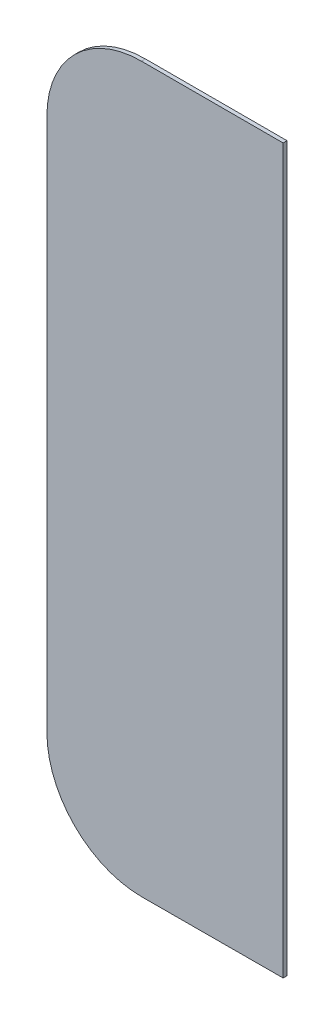
ISO-10303-21;
HEADER;
FILE_DESCRIPTION(('STEP AP214'),'2;1');
FILE_NAME('part.step','',(''),(''),'','','');
FILE_SCHEMA(('AUTOMOTIVE_DESIGN { 1 0 10303 214 1 1 1 1 }'));
ENDSEC;
DATA;
#1=APPLICATION_CONTEXT('core data for automotive mechanical design processes');
#2=APPLICATION_PROTOCOL_DEFINITION('international standard','automotive_design',2000,#1);
#3=PRODUCT_CONTEXT('',#1,'mechanical');
#4=PRODUCT('Part','Part','',(#3));
#5=PRODUCT_RELATED_PRODUCT_CATEGORY('part','',(#4));
#6=PRODUCT_DEFINITION_FORMATION('','',#4);
#7=PRODUCT_DEFINITION_CONTEXT('part definition',#1,'design');
#8=PRODUCT_DEFINITION('design','',#6,#7);
#9=PRODUCT_DEFINITION_SHAPE('','',#8);
#10=(LENGTH_UNIT() NAMED_UNIT(*) SI_UNIT(.MILLI.,.METRE.));
#11=(NAMED_UNIT(*) PLANE_ANGLE_UNIT() SI_UNIT($,.RADIAN.));
#12=(NAMED_UNIT(*) SI_UNIT($,.STERADIAN.) SOLID_ANGLE_UNIT());
#13=UNCERTAINTY_MEASURE_WITH_UNIT(LENGTH_MEASURE(1.E-05),#10,'distance_accuracy_value','');
#14=(GEOMETRIC_REPRESENTATION_CONTEXT(3) GLOBAL_UNCERTAINTY_ASSIGNED_CONTEXT((#13)) GLOBAL_UNIT_ASSIGNED_CONTEXT((#10,
#11,#12)) REPRESENTATION_CONTEXT('',''));
#15=CARTESIAN_POINT('',(0.,0.,0.));
#16=DIRECTION('',(0.,0.,1.));
#17=DIRECTION('',(1.,0.,0.));
#18=AXIS2_PLACEMENT_3D('',#15,#16,#17);
#19=CARTESIAN_POINT('',(-12.7,-291.608274925451,3.175));
#20=DIRECTION('',(-1.,0.,0.));
#21=DIRECTION('',(0.,-1.,0.));
#22=AXIS2_PLACEMENT_3D('',#19,#20,#21);
#23=PLANE('',#22);
#24=DIRECTION('',(0.,1.,0.));
#25=VECTOR('',#24,1.);
#26=CARTESIAN_POINT('',(-12.7,-291.608274925451,0.));
#27=LINE('',#26,#25);
#28=CARTESIAN_POINT('',(-12.7,-291.608274925451,0.));
#29=VERTEX_POINT('',#28);
#30=CARTESIAN_POINT('',(-12.7,291.608274925451,0.));
#31=VERTEX_POINT('',#30);
#32=EDGE_CURVE('E120',#29,#31,#27,.T.);
#33=ORIENTED_EDGE('',*,*,#32,.T.);
#34=DIRECTION('',(0.,0.,-1.));
#35=VECTOR('',#34,1.);
#36=CARTESIAN_POINT('',(-12.7,291.608274925451,3.175));
#37=LINE('',#36,#35);
#38=CARTESIAN_POINT('',(-12.7,291.608274925451,3.175));
#39=VERTEX_POINT('',#38);
#40=EDGE_CURVE('E11',#39,#31,#37,.T.);
#41=ORIENTED_EDGE('',*,*,#40,.F.);
#42=DIRECTION('',(0.,1.,0.));
#43=VECTOR('',#42,1.);
#44=CARTESIAN_POINT('',(-12.7,-291.608274925451,3.175));
#45=LINE('',#44,#43);
#46=CARTESIAN_POINT('',(-12.7,-291.608274925451,3.175));
#47=VERTEX_POINT('',#46);
#48=EDGE_CURVE('E130',#47,#39,#45,.T.);
#49=ORIENTED_EDGE('',*,*,#48,.F.);
#50=DIRECTION('',(0.,0.,-1.));
#51=VECTOR('',#50,1.);
#52=CARTESIAN_POINT('',(-12.7,-291.608274925451,3.175));
#53=LINE('',#52,#51);
#54=EDGE_CURVE('E116',#47,#29,#53,.T.);
#55=ORIENTED_EDGE('',*,*,#54,.T.);
#56=EDGE_LOOP('',(#33,#41,#49,#55));
#57=FACE_BOUND('',#56,.T.);
#58=ADVANCED_FACE('F36',(#57),#23,.F.);
#59=CARTESIAN_POINT('',(-12.7,291.608274925451,3.175));
#60=DIRECTION('',(0.,-1.,0.));
#61=DIRECTION('',(1.,0.,0.));
#62=AXIS2_PLACEMENT_3D('',#59,#60,#61);
#63=PLANE('',#62);
#64=DIRECTION('',(-1.,0.,0.));
#65=VECTOR('',#64,1.);
#66=CARTESIAN_POINT('',(-12.7,291.608274925451,0.));
#67=LINE('',#66,#65);
#68=CARTESIAN_POINT('',(-127.,291.60827492545,0.));
#69=VERTEX_POINT('',#68);
#70=EDGE_CURVE('E123',#31,#69,#67,.T.);
#71=ORIENTED_EDGE('',*,*,#70,.T.);
#72=DIRECTION('',(0.,0.,-1.));
#73=VECTOR('',#72,1.);
#74=CARTESIAN_POINT('',(-127.,291.60827492545,3.175));
#75=LINE('',#74,#73);
#76=CARTESIAN_POINT('',(-127.,291.60827492545,3.175));
#77=VERTEX_POINT('',#76);
#78=EDGE_CURVE('E44',#77,#69,#75,.T.);
#79=ORIENTED_EDGE('',*,*,#78,.F.);
#80=DIRECTION('',(-1.,0.,0.));
#81=VECTOR('',#80,1.);
#82=CARTESIAN_POINT('',(-12.7,291.608274925451,3.175));
#83=LINE('',#82,#81);
#84=EDGE_CURVE('E89',#39,#77,#83,.T.);
#85=ORIENTED_EDGE('',*,*,#84,.F.);
#86=ORIENTED_EDGE('',*,*,#40,.T.);
#87=EDGE_LOOP('',(#71,#79,#85,#86));
#88=FACE_BOUND('',#87,.T.);
#89=ADVANCED_FACE('F154',(#88),#63,.F.);
#90=CARTESIAN_POINT('',(-127.,215.40827492545,3.175));
#91=DIRECTION('',(0.,0.,-1.));
#92=DIRECTION('',(-1.,0.,0.));
#93=AXIS2_PLACEMENT_3D('',#90,#91,#92);
#94=CYLINDRICAL_SURFACE('',#93,76.1999999999999);
#95=CARTESIAN_POINT('',(-127.,215.40827492545,0.));
#96=DIRECTION('',(0.,0.,1.));
#97=DIRECTION('',(1.,0.,0.));
#98=AXIS2_PLACEMENT_3D('',#95,#96,#97);
#99=CIRCLE('',#98,76.1999999999999);
#100=CARTESIAN_POINT('',(-203.2,215.40827492545,0.));
#101=VERTEX_POINT('',#100);
#102=EDGE_CURVE('E125',#69,#101,#99,.T.);
#103=ORIENTED_EDGE('',*,*,#102,.T.);
#104=DIRECTION('',(0.,0.,-1.));
#105=VECTOR('',#104,1.);
#106=CARTESIAN_POINT('',(-203.2,215.40827492545,3.175));
#107=LINE('',#106,#105);
#108=CARTESIAN_POINT('',(-203.2,215.40827492545,3.175));
#109=VERTEX_POINT('',#108);
#110=EDGE_CURVE('E111',#109,#101,#107,.T.);
#111=ORIENTED_EDGE('',*,*,#110,.F.);
#112=CARTESIAN_POINT('',(-127.,215.40827492545,3.175));
#113=DIRECTION('',(0.,0.,1.));
#114=DIRECTION('',(1.,0.,0.));
#115=AXIS2_PLACEMENT_3D('',#112,#113,#114);
#116=CIRCLE('',#115,76.1999999999999);
#117=EDGE_CURVE('E102',#77,#109,#116,.T.);
#118=ORIENTED_EDGE('',*,*,#117,.F.);
#119=ORIENTED_EDGE('',*,*,#78,.T.);
#120=EDGE_LOOP('',(#103,#111,#118,#119));
#121=FACE_BOUND('',#120,.T.);
#122=ADVANCED_FACE('F136',(#121),#94,.T.);
#123=CARTESIAN_POINT('',(-203.2,215.40827492545,3.175));
#124=DIRECTION('',(1.,0.,0.));
#125=DIRECTION('',(0.,1.,0.));
#126=AXIS2_PLACEMENT_3D('',#123,#124,#125);
#127=PLANE('',#126);
#128=DIRECTION('',(0.,-1.,0.));
#129=VECTOR('',#128,1.);
#130=CARTESIAN_POINT('',(-203.2,215.40827492545,0.));
#131=LINE('',#130,#129);
#132=CARTESIAN_POINT('',(-203.2,-215.408274925451,0.));
#133=VERTEX_POINT('',#132);
#134=EDGE_CURVE('E110',#101,#133,#131,.T.);
#135=ORIENTED_EDGE('',*,*,#134,.T.);
#136=DIRECTION('',(0.,0.,-1.));
#137=VECTOR('',#136,1.);
#138=CARTESIAN_POINT('',(-203.2,-215.408274925451,3.175));
#139=LINE('',#138,#137);
#140=CARTESIAN_POINT('',(-203.2,-215.408274925451,3.175));
#141=VERTEX_POINT('',#140);
#142=EDGE_CURVE('E107',#141,#133,#139,.T.);
#143=ORIENTED_EDGE('',*,*,#142,.F.);
#144=DIRECTION('',(0.,-1.,0.));
#145=VECTOR('',#144,1.);
#146=CARTESIAN_POINT('',(-203.2,215.40827492545,3.175));
#147=LINE('',#146,#145);
#148=EDGE_CURVE('E96',#109,#141,#147,.T.);
#149=ORIENTED_EDGE('',*,*,#148,.F.);
#150=ORIENTED_EDGE('',*,*,#110,.T.);
#151=EDGE_LOOP('',(#135,#143,#149,#150));
#152=FACE_BOUND('',#151,.T.);
#153=ADVANCED_FACE('F108',(#152),#127,.F.);
#154=CARTESIAN_POINT('',(-126.684599629993,-215.408274925451,3.175));
#155=DIRECTION('',(0.,0.,-1.));
#156=DIRECTION('',(-1.,0.,0.));
#157=AXIS2_PLACEMENT_3D('',#154,#155,#156);
#158=CYLINDRICAL_SURFACE('',#157,76.5154003700072);
#159=CARTESIAN_POINT('',(-126.684599629993,-215.408274925451,0.));
#160=DIRECTION('',(0.,0.,1.));
#161=DIRECTION('',(1.,0.,0.));
#162=AXIS2_PLACEMENT_3D('',#159,#160,#161);
#163=CIRCLE('',#162,76.5154003700072);
#164=CARTESIAN_POINT('',(-127.,-291.923025244517,0.));
#165=VERTEX_POINT('',#164);
#166=EDGE_CURVE('E75',#133,#165,#163,.T.);
#167=ORIENTED_EDGE('',*,*,#166,.T.);
#168=DIRECTION('',(0.,0.,-1.));
#169=VECTOR('',#168,1.);
#170=CARTESIAN_POINT('',(-127.,-291.923025244517,3.175));
#171=LINE('',#170,#169);
#172=CARTESIAN_POINT('',(-127.,-291.923025244517,3.175));
#173=VERTEX_POINT('',#172);
#174=EDGE_CURVE('E112',#173,#165,#171,.T.);
#175=ORIENTED_EDGE('',*,*,#174,.F.);
#176=CARTESIAN_POINT('',(-126.684599629993,-215.408274925451,3.175));
#177=DIRECTION('',(0.,0.,1.));
#178=DIRECTION('',(1.,0.,0.));
#179=AXIS2_PLACEMENT_3D('',#176,#177,#178);
#180=CIRCLE('',#179,76.5154003700072);
#181=EDGE_CURVE('E100',#141,#173,#180,.T.);
#182=ORIENTED_EDGE('',*,*,#181,.F.);
#183=ORIENTED_EDGE('',*,*,#142,.T.);
#184=EDGE_LOOP('',(#167,#175,#182,#183));
#185=FACE_BOUND('',#184,.T.);
#186=ADVANCED_FACE('F114',(#185),#158,.T.);
#187=CARTESIAN_POINT('',(-127.,-291.923025244517,3.175));
#188=DIRECTION('',(-0.00275371063605371,0.999996208531679,0.));
#189=DIRECTION('',(-0.999996208531679,-0.00275371063605371,0.));
#190=AXIS2_PLACEMENT_3D('',#187,#188,#189);
#191=PLANE('',#190);
#192=DIRECTION('',(0.999996208531679,0.00275371063605371,0.));
#193=VECTOR('',#192,1.);
#194=CARTESIAN_POINT('',(-127.,-291.923025244517,0.));
#195=LINE('',#194,#193);
#196=EDGE_CURVE('E81',#165,#29,#195,.T.);
#197=ORIENTED_EDGE('',*,*,#196,.T.);
#198=ORIENTED_EDGE('',*,*,#54,.F.);
#199=DIRECTION('',(0.999996208531679,0.00275371063605371,0.));
#200=VECTOR('',#199,1.);
#201=CARTESIAN_POINT('',(-127.,-291.923025244517,3.175));
#202=LINE('',#201,#200);
#203=EDGE_CURVE('E52',#173,#47,#202,.T.);
#204=ORIENTED_EDGE('',*,*,#203,.F.);
#205=ORIENTED_EDGE('',*,*,#174,.T.);
#206=EDGE_LOOP('',(#197,#198,#204,#205));
#207=FACE_BOUND('',#206,.T.);
#208=ADVANCED_FACE('F143',(#207),#191,.F.);
#209=CARTESIAN_POINT('',(-127.,215.40827492545,3.175));
#210=DIRECTION('',(0.,0.,1.));
#211=DIRECTION('',(1.,0.,0.));
#212=AXIS2_PLACEMENT_3D('',#209,#210,#211);
#213=PLANE('',#212);
#214=ORIENTED_EDGE('',*,*,#48,.T.);
#215=ORIENTED_EDGE('',*,*,#84,.T.);
#216=ORIENTED_EDGE('',*,*,#117,.T.);
#217=ORIENTED_EDGE('',*,*,#148,.T.);
#218=ORIENTED_EDGE('',*,*,#181,.T.);
#219=ORIENTED_EDGE('',*,*,#203,.T.);
#220=EDGE_LOOP('',(#214,#215,#216,#217,#218,#219));
#221=FACE_BOUND('',#220,.T.);
#222=ADVANCED_FACE('F98',(#221),#213,.T.);
#223=CARTESIAN_POINT('',(-127.,215.40827492545,0.));
#224=DIRECTION('',(0.,0.,1.));
#225=DIRECTION('',(1.,0.,0.));
#226=AXIS2_PLACEMENT_3D('',#223,#224,#225);
#227=PLANE('',#226);
#228=ORIENTED_EDGE('',*,*,#32,.F.);
#229=ORIENTED_EDGE('',*,*,#196,.F.);
#230=ORIENTED_EDGE('',*,*,#166,.F.);
#231=ORIENTED_EDGE('',*,*,#134,.F.);
#232=ORIENTED_EDGE('',*,*,#102,.F.);
#233=ORIENTED_EDGE('',*,*,#70,.F.);
#234=EDGE_LOOP('',(#228,#229,#230,#231,#232,#233));
#235=FACE_BOUND('',#234,.T.);
#236=ADVANCED_FACE('F139',(#235),#227,.F.);
#237=CLOSED_SHELL('',(#58,#89,#122,#153,#186,#208,#222,#236));
#238=MANIFOLD_SOLID_BREP('B2',#237);
#239=ADVANCED_BREP_SHAPE_REPRESENTATION('',(#18,#238),#14);
#240=SHAPE_DEFINITION_REPRESENTATION(#9,#239);
ENDSEC;
END-ISO-10303-21;
